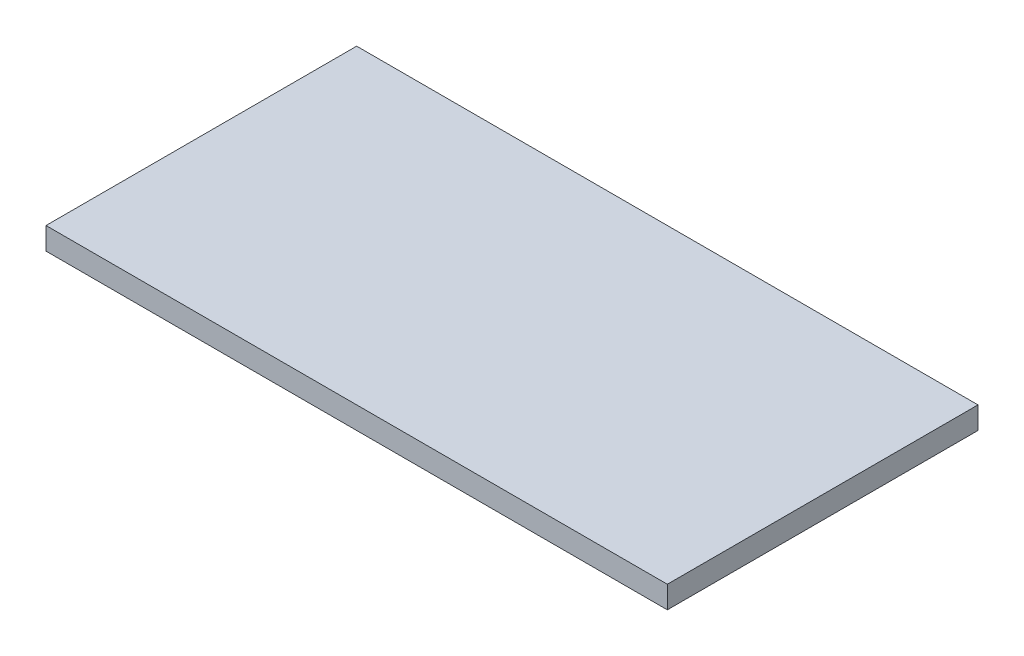
ISO-10303-21;
HEADER;
FILE_DESCRIPTION(('STEP AP214'),'2;1');
FILE_NAME('part.step','',(''),(''),'','','');
FILE_SCHEMA(('AUTOMOTIVE_DESIGN { 1 0 10303 214 1 1 1 1 }'));
ENDSEC;
DATA;
#1=APPLICATION_CONTEXT('core data for automotive mechanical design processes');
#2=APPLICATION_PROTOCOL_DEFINITION('international standard','automotive_design',2000,#1);
#3=PRODUCT_CONTEXT('',#1,'mechanical');
#4=PRODUCT('Part','Part','',(#3));
#5=PRODUCT_RELATED_PRODUCT_CATEGORY('part','',(#4));
#6=PRODUCT_DEFINITION_FORMATION('','',#4);
#7=PRODUCT_DEFINITION_CONTEXT('part definition',#1,'design');
#8=PRODUCT_DEFINITION('design','',#6,#7);
#9=PRODUCT_DEFINITION_SHAPE('','',#8);
#10=(LENGTH_UNIT() NAMED_UNIT(*) SI_UNIT(.MILLI.,.METRE.));
#11=(NAMED_UNIT(*) PLANE_ANGLE_UNIT() SI_UNIT($,.RADIAN.));
#12=(NAMED_UNIT(*) SI_UNIT($,.STERADIAN.) SOLID_ANGLE_UNIT());
#13=UNCERTAINTY_MEASURE_WITH_UNIT(LENGTH_MEASURE(1.E-05),#10,'distance_accuracy_value','');
#14=(GEOMETRIC_REPRESENTATION_CONTEXT(3) GLOBAL_UNCERTAINTY_ASSIGNED_CONTEXT((#13)) GLOBAL_UNIT_ASSIGNED_CONTEXT((#10,
#11,#12)) REPRESENTATION_CONTEXT('',''));
#15=CARTESIAN_POINT('',(0.,0.,0.));
#16=DIRECTION('',(0.,0.,1.));
#17=DIRECTION('',(1.,0.,0.));
#18=AXIS2_PLACEMENT_3D('',#15,#16,#17);
#19=CARTESIAN_POINT('',(0.,2.,0.));
#20=DIRECTION('',(1.,0.,0.));
#21=DIRECTION('',(0.,0.,-1.));
#22=AXIS2_PLACEMENT_3D('',#19,#20,#21);
#23=PLANE('',#22);
#24=DIRECTION('',(0.,0.,1.));
#25=VECTOR('',#24,1.);
#26=CARTESIAN_POINT('',(0.,0.,0.));
#27=LINE('',#26,#25);
#28=CARTESIAN_POINT('',(0.,0.,-28.));
#29=VERTEX_POINT('',#28);
#30=CARTESIAN_POINT('',(0.,0.,0.));
#31=VERTEX_POINT('',#30);
#32=EDGE_CURVE('E96',#29,#31,#27,.T.);
#33=ORIENTED_EDGE('',*,*,#32,.T.);
#34=DIRECTION('',(0.,-1.,0.));
#35=VECTOR('',#34,1.);
#36=CARTESIAN_POINT('',(0.,2.,0.));
#37=LINE('',#36,#35);
#38=CARTESIAN_POINT('',(0.,2.,0.));
#39=VERTEX_POINT('',#38);
#40=EDGE_CURVE('E11',#39,#31,#37,.T.);
#41=ORIENTED_EDGE('',*,*,#40,.F.);
#42=DIRECTION('',(0.,0.,1.));
#43=VECTOR('',#42,1.);
#44=CARTESIAN_POINT('',(0.,2.,0.));
#45=LINE('',#44,#43);
#46=CARTESIAN_POINT('',(0.,2.,-28.));
#47=VERTEX_POINT('',#46);
#48=EDGE_CURVE('E84',#47,#39,#45,.T.);
#49=ORIENTED_EDGE('',*,*,#48,.F.);
#50=DIRECTION('',(0.,-1.,0.));
#51=VECTOR('',#50,1.);
#52=CARTESIAN_POINT('',(0.,2.,-28.));
#53=LINE('',#52,#51);
#54=EDGE_CURVE('E92',#47,#29,#53,.T.);
#55=ORIENTED_EDGE('',*,*,#54,.T.);
#56=EDGE_LOOP('',(#33,#41,#49,#55));
#57=FACE_BOUND('',#56,.T.);
#58=ADVANCED_FACE('F33',(#57),#23,.F.);
#59=CARTESIAN_POINT('',(0.,2.,0.));
#60=DIRECTION('',(0.,0.,-1.));
#61=DIRECTION('',(-1.,0.,0.));
#62=AXIS2_PLACEMENT_3D('',#59,#60,#61);
#63=PLANE('',#62);
#64=DIRECTION('',(1.,0.,0.));
#65=VECTOR('',#64,1.);
#66=CARTESIAN_POINT('',(0.,0.,0.));
#67=LINE('',#66,#65);
#68=CARTESIAN_POINT('',(56.,0.,0.));
#69=VERTEX_POINT('',#68);
#70=EDGE_CURVE('E88',#31,#69,#67,.T.);
#71=ORIENTED_EDGE('',*,*,#70,.T.);
#72=DIRECTION('',(0.,-1.,0.));
#73=VECTOR('',#72,1.);
#74=CARTESIAN_POINT('',(56.,2.,0.));
#75=LINE('',#74,#73);
#76=CARTESIAN_POINT('',(56.,2.,0.));
#77=VERTEX_POINT('',#76);
#78=EDGE_CURVE('E41',#77,#69,#75,.T.);
#79=ORIENTED_EDGE('',*,*,#78,.F.);
#80=DIRECTION('',(1.,0.,0.));
#81=VECTOR('',#80,1.);
#82=CARTESIAN_POINT('',(0.,2.,0.));
#83=LINE('',#82,#81);
#84=EDGE_CURVE('E79',#39,#77,#83,.T.);
#85=ORIENTED_EDGE('',*,*,#84,.F.);
#86=ORIENTED_EDGE('',*,*,#40,.T.);
#87=EDGE_LOOP('',(#71,#79,#85,#86));
#88=FACE_BOUND('',#87,.T.);
#89=ADVANCED_FACE('F87',(#88),#63,.F.);
#90=CARTESIAN_POINT('',(56.,2.,0.));
#91=DIRECTION('',(-1.,0.,0.));
#92=DIRECTION('',(0.,0.,1.));
#93=AXIS2_PLACEMENT_3D('',#90,#91,#92);
#94=PLANE('',#93);
#95=DIRECTION('',(0.,0.,-1.));
#96=VECTOR('',#95,1.);
#97=CARTESIAN_POINT('',(56.,0.,0.));
#98=LINE('',#97,#96);
#99=CARTESIAN_POINT('',(56.,0.,-28.));
#100=VERTEX_POINT('',#99);
#101=EDGE_CURVE('E66',#69,#100,#98,.T.);
#102=ORIENTED_EDGE('',*,*,#101,.T.);
#103=DIRECTION('',(0.,-1.,0.));
#104=VECTOR('',#103,1.);
#105=CARTESIAN_POINT('',(56.,2.,-28.));
#106=LINE('',#105,#104);
#107=CARTESIAN_POINT('',(56.,2.,-28.));
#108=VERTEX_POINT('',#107);
#109=EDGE_CURVE('E89',#108,#100,#106,.T.);
#110=ORIENTED_EDGE('',*,*,#109,.F.);
#111=DIRECTION('',(0.,0.,-1.));
#112=VECTOR('',#111,1.);
#113=CARTESIAN_POINT('',(56.,2.,0.));
#114=LINE('',#113,#112);
#115=EDGE_CURVE('E82',#77,#108,#114,.T.);
#116=ORIENTED_EDGE('',*,*,#115,.F.);
#117=ORIENTED_EDGE('',*,*,#78,.T.);
#118=EDGE_LOOP('',(#102,#110,#116,#117));
#119=FACE_BOUND('',#118,.T.);
#120=ADVANCED_FACE('F90',(#119),#94,.F.);
#121=CARTESIAN_POINT('',(0.,2.,-28.));
#122=DIRECTION('',(0.,0.,1.));
#123=DIRECTION('',(1.,0.,0.));
#124=AXIS2_PLACEMENT_3D('',#121,#122,#123);
#125=PLANE('',#124);
#126=DIRECTION('',(-1.,0.,0.));
#127=VECTOR('',#126,1.);
#128=CARTESIAN_POINT('',(0.,0.,-28.));
#129=LINE('',#128,#127);
#130=EDGE_CURVE('E72',#100,#29,#129,.T.);
#131=ORIENTED_EDGE('',*,*,#130,.T.);
#132=ORIENTED_EDGE('',*,*,#54,.F.);
#133=DIRECTION('',(-1.,0.,0.));
#134=VECTOR('',#133,1.);
#135=CARTESIAN_POINT('',(0.,2.,-28.));
#136=LINE('',#135,#134);
#137=EDGE_CURVE('E49',#108,#47,#136,.T.);
#138=ORIENTED_EDGE('',*,*,#137,.F.);
#139=ORIENTED_EDGE('',*,*,#109,.T.);
#140=EDGE_LOOP('',(#131,#132,#138,#139));
#141=FACE_BOUND('',#140,.T.);
#142=ADVANCED_FACE('F103',(#141),#125,.F.);
#143=CARTESIAN_POINT('',(0.,2.,0.));
#144=DIRECTION('',(0.,-1.,0.));
#145=DIRECTION('',(0.,0.,-1.));
#146=AXIS2_PLACEMENT_3D('',#143,#144,#145);
#147=PLANE('',#146);
#148=ORIENTED_EDGE('',*,*,#48,.T.);
#149=ORIENTED_EDGE('',*,*,#84,.T.);
#150=ORIENTED_EDGE('',*,*,#115,.T.);
#151=ORIENTED_EDGE('',*,*,#137,.T.);
#152=EDGE_LOOP('',(#148,#149,#150,#151));
#153=FACE_BOUND('',#152,.T.);
#154=ADVANCED_FACE('F80',(#153),#147,.F.);
#155=CARTESIAN_POINT('',(0.,0.,0.));
#156=DIRECTION('',(0.,-1.,0.));
#157=DIRECTION('',(0.,0.,-1.));
#158=AXIS2_PLACEMENT_3D('',#155,#156,#157);
#159=PLANE('',#158);
#160=ORIENTED_EDGE('',*,*,#32,.F.);
#161=ORIENTED_EDGE('',*,*,#130,.F.);
#162=ORIENTED_EDGE('',*,*,#101,.F.);
#163=ORIENTED_EDGE('',*,*,#70,.F.);
#164=EDGE_LOOP('',(#160,#161,#162,#163));
#165=FACE_BOUND('',#164,.T.);
#166=ADVANCED_FACE('F106',(#165),#159,.T.);
#167=CLOSED_SHELL('',(#58,#89,#120,#142,#154,#166));
#168=MANIFOLD_SOLID_BREP('B2',#167);
#169=ADVANCED_BREP_SHAPE_REPRESENTATION('',(#18,#168),#14);
#170=SHAPE_DEFINITION_REPRESENTATION(#9,#169);
ENDSEC;
END-ISO-10303-21;
